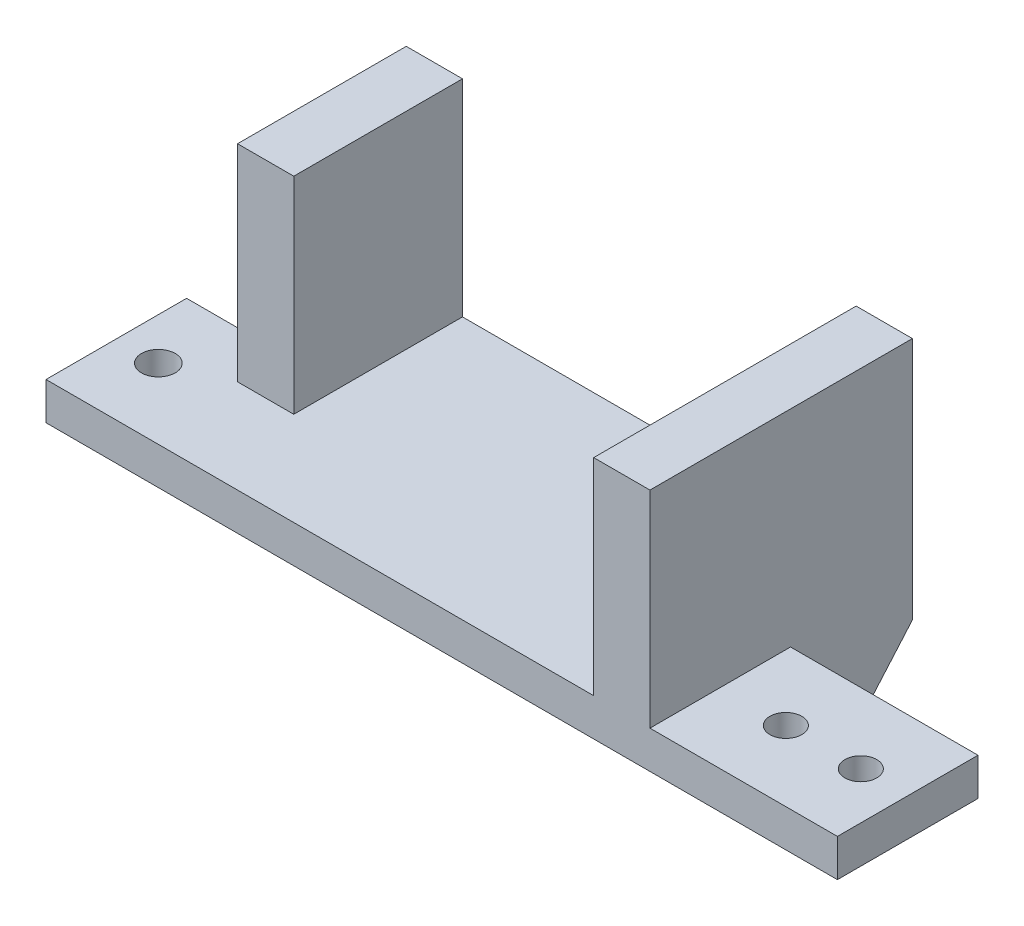
ISO-10303-21;
HEADER;
FILE_DESCRIPTION(('STEP AP214'),'2;1');
FILE_NAME('part.step','',(''),(''),'','','');
FILE_SCHEMA(('AUTOMOTIVE_DESIGN { 1 0 10303 214 1 1 1 1 }'));
ENDSEC;
DATA;
#1=APPLICATION_CONTEXT('core data for automotive mechanical design processes');
#2=APPLICATION_PROTOCOL_DEFINITION('international standard','automotive_design',2000,#1);
#3=PRODUCT_CONTEXT('',#1,'mechanical');
#4=PRODUCT('Part','Part','',(#3));
#5=PRODUCT_RELATED_PRODUCT_CATEGORY('part','',(#4));
#6=PRODUCT_DEFINITION_FORMATION('','',#4);
#7=PRODUCT_DEFINITION_CONTEXT('part definition',#1,'design');
#8=PRODUCT_DEFINITION('design','',#6,#7);
#9=PRODUCT_DEFINITION_SHAPE('','',#8);
#10=(LENGTH_UNIT() NAMED_UNIT(*) SI_UNIT(.MILLI.,.METRE.));
#11=(NAMED_UNIT(*) PLANE_ANGLE_UNIT() SI_UNIT($,.RADIAN.));
#12=(NAMED_UNIT(*) SI_UNIT($,.STERADIAN.) SOLID_ANGLE_UNIT());
#13=UNCERTAINTY_MEASURE_WITH_UNIT(LENGTH_MEASURE(1.E-05),#10,'distance_accuracy_value','');
#14=(GEOMETRIC_REPRESENTATION_CONTEXT(3) GLOBAL_UNCERTAINTY_ASSIGNED_CONTEXT((#13)) GLOBAL_UNIT_ASSIGNED_CONTEXT((#10,
#11,#12)) REPRESENTATION_CONTEXT('',''));
#15=CARTESIAN_POINT('',(0.,0.,0.));
#16=DIRECTION('',(0.,0.,1.));
#17=DIRECTION('',(1.,0.,0.));
#18=AXIS2_PLACEMENT_3D('',#15,#16,#17);
#19=CARTESIAN_POINT('',(0.,0.,0.));
#20=DIRECTION('',(0.,0.,1.));
#21=DIRECTION('',(1.,0.,0.));
#22=AXIS2_PLACEMENT_3D('',#19,#20,#21);
#23=PLANE('',#22);
#24=DIRECTION('',(-1.,0.,0.));
#25=VECTOR('',#24,1.);
#26=CARTESIAN_POINT('',(0.,0.,0.));
#27=LINE('',#26,#25);
#28=CARTESIAN_POINT('',(-27.,0.,0.));
#29=VERTEX_POINT('',#28);
#30=CARTESIAN_POINT('',(-37.4348056006468,0.,0.));
#31=VERTEX_POINT('',#30);
#32=EDGE_CURVE('E329',#29,#31,#27,.T.);
#33=ORIENTED_EDGE('',*,*,#32,.T.);
#34=DIRECTION('',(0.,1.,0.));
#35=VECTOR('',#34,1.);
#36=CARTESIAN_POINT('',(-37.4348056006468,-11.,0.));
#37=LINE('',#36,#35);
#38=CARTESIAN_POINT('',(-37.4348056006468,4.00000000000001,0.));
#39=VERTEX_POINT('',#38);
#40=EDGE_CURVE('E257',#31,#39,#37,.T.);
#41=ORIENTED_EDGE('',*,*,#40,.T.);
#42=DIRECTION('',(-1.,0.,0.));
#43=VECTOR('',#42,1.);
#44=CARTESIAN_POINT('',(0.,4.00000000000001,0.));
#45=LINE('',#44,#43);
#46=CARTESIAN_POINT('',(-27.,4.00000000000001,0.));
#47=VERTEX_POINT('',#46);
#48=EDGE_CURVE('E341',#47,#39,#45,.T.);
#49=ORIENTED_EDGE('',*,*,#48,.F.);
#50=DIRECTION('',(0.,1.,0.));
#51=VECTOR('',#50,1.);
#52=CARTESIAN_POINT('',(-27.,26.,0.));
#53=LINE('',#52,#51);
#54=EDGE_CURVE('E301',#29,#47,#53,.T.);
#55=ORIENTED_EDGE('',*,*,#54,.F.);
#56=EDGE_LOOP('',(#33,#41,#49,#55));
#57=FACE_BOUND('',#56,.T.);
#58=ADVANCED_FACE('F46',(#57),#23,.F.);
#59=DIRECTION('',(0.,-1.,0.));
#60=VECTOR('',#59,1.);
#61=CARTESIAN_POINT('',(27.,26.,0.));
#62=LINE('',#61,#60);
#63=CARTESIAN_POINT('',(27.,4.00000000000001,0.));
#64=VERTEX_POINT('',#63);
#65=CARTESIAN_POINT('',(27.,0.,0.));
#66=VERTEX_POINT('',#65);
#67=EDGE_CURVE('E330',#64,#66,#62,.T.);
#68=ORIENTED_EDGE('',*,*,#67,.F.);
#69=DIRECTION('',(1.,0.,0.));
#70=VECTOR('',#69,1.);
#71=CARTESIAN_POINT('',(0.,4.00000000000001,0.));
#72=LINE('',#71,#70);
#73=CARTESIAN_POINT('',(47.,4.00000000000001,0.));
#74=VERTEX_POINT('',#73);
#75=EDGE_CURVE('E365',#64,#74,#72,.T.);
#76=ORIENTED_EDGE('',*,*,#75,.T.);
#77=DIRECTION('',(0.,-1.,0.));
#78=VECTOR('',#77,1.);
#79=CARTESIAN_POINT('',(47.,0.,0.));
#80=LINE('',#79,#78);
#81=CARTESIAN_POINT('',(47.,0.,0.));
#82=VERTEX_POINT('',#81);
#83=EDGE_CURVE('E362',#74,#82,#80,.T.);
#84=ORIENTED_EDGE('',*,*,#83,.T.);
#85=EDGE_CURVE('E359',#82,#66,#27,.T.);
#86=ORIENTED_EDGE('',*,*,#85,.T.);
#87=EDGE_LOOP('',(#68,#76,#84,#86));
#88=FACE_BOUND('',#87,.T.);
#89=ADVANCED_FACE('F457',(#88),#23,.F.);
#90=CARTESIAN_POINT('',(0.,0.,15.));
#91=DIRECTION('',(0.,-1.,0.));
#92=DIRECTION('',(1.,0.,0.));
#93=AXIS2_PLACEMENT_3D('',#90,#91,#92);
#94=PLANE('',#93);
#95=DIRECTION('',(-1.,0.,0.));
#96=VECTOR('',#95,1.);
#97=CARTESIAN_POINT('',(27.,0.,0.));
#98=LINE('',#97,#96);
#99=EDGE_CURVE('E240',#66,#29,#98,.T.);
#100=ORIENTED_EDGE('',*,*,#99,.F.);
#101=ORIENTED_EDGE('',*,*,#85,.F.);
#102=DIRECTION('',(0.,0.,-1.));
#103=VECTOR('',#102,1.);
#104=CARTESIAN_POINT('',(47.,0.,15.));
#105=LINE('',#104,#103);
#106=CARTESIAN_POINT('',(47.,0.,15.));
#107=VERTEX_POINT('',#106);
#108=EDGE_CURVE('E334',#107,#82,#105,.T.);
#109=ORIENTED_EDGE('',*,*,#108,.F.);
#110=DIRECTION('',(-1.,0.,0.));
#111=VECTOR('',#110,1.);
#112=CARTESIAN_POINT('',(0.,0.,15.));
#113=LINE('',#112,#111);
#114=CARTESIAN_POINT('',(-37.4348056006468,0.,15.));
#115=VERTEX_POINT('',#114);
#116=EDGE_CURVE('E337',#107,#115,#113,.T.);
#117=ORIENTED_EDGE('',*,*,#116,.T.);
#118=DIRECTION('',(0.,0.,1.));
#119=VECTOR('',#118,1.);
#120=CARTESIAN_POINT('',(-37.4348056006468,0.,15.));
#121=LINE('',#120,#119);
#122=EDGE_CURVE('E261',#31,#115,#121,.T.);
#123=ORIENTED_EDGE('',*,*,#122,.F.);
#124=ORIENTED_EDGE('',*,*,#32,.F.);
#125=EDGE_LOOP('',(#100,#101,#109,#117,#123,#124));
#126=FACE_BOUND('',#125,.T.);
#127=CARTESIAN_POINT('',(34.,0.,7.5));
#128=DIRECTION('',(0.,-1.,0.));
#129=DIRECTION('',(1.,0.,0.));
#130=AXIS2_PLACEMENT_3D('',#127,#128,#129);
#131=CIRCLE('',#130,1.7);
#132=CARTESIAN_POINT('',(35.7,0.,7.5));
#133=VERTEX_POINT('',#132);
#134=EDGE_CURVE('E276',#133,#133,#131,.T.);
#135=ORIENTED_EDGE('',*,*,#134,.F.);
#136=EDGE_LOOP('',(#135));
#137=FACE_BOUND('',#136,.T.);
#138=CARTESIAN_POINT('',(42.,0.,7.5));
#139=DIRECTION('',(0.,-1.,0.));
#140=DIRECTION('',(1.,0.,0.));
#141=AXIS2_PLACEMENT_3D('',#138,#139,#140);
#142=CIRCLE('',#141,1.7);
#143=CARTESIAN_POINT('',(43.7,0.,7.5));
#144=VERTEX_POINT('',#143);
#145=EDGE_CURVE('E273',#144,#144,#142,.T.);
#146=ORIENTED_EDGE('',*,*,#145,.F.);
#147=EDGE_LOOP('',(#146));
#148=FACE_BOUND('',#147,.T.);
#149=CARTESIAN_POINT('',(-32.9497943466124,0.,7.5));
#150=DIRECTION('',(0.,-1.,0.));
#151=DIRECTION('',(1.,0.,0.));
#152=AXIS2_PLACEMENT_3D('',#149,#150,#151);
#153=CIRCLE('',#152,1.8);
#154=CARTESIAN_POINT('',(-31.1497943466124,0.,7.5));
#155=VERTEX_POINT('',#154);
#156=EDGE_CURVE('E270',#155,#155,#153,.T.);
#157=ORIENTED_EDGE('',*,*,#156,.F.);
#158=EDGE_LOOP('',(#157));
#159=FACE_BOUND('',#158,.T.);
#160=ADVANCED_FACE('F48',(#126,#137,#148,#159),#94,.T.);
#161=CARTESIAN_POINT('',(47.,0.,15.));
#162=DIRECTION('',(1.,0.,0.));
#163=DIRECTION('',(0.,0.,-1.));
#164=AXIS2_PLACEMENT_3D('',#161,#162,#163);
#165=PLANE('',#164);
#166=ORIENTED_EDGE('',*,*,#83,.F.);
#167=DIRECTION('',(0.,0.,-1.));
#168=VECTOR('',#167,1.);
#169=CARTESIAN_POINT('',(47.,4.00000000000001,15.));
#170=LINE('',#169,#168);
#171=CARTESIAN_POINT('',(47.,4.00000000000001,15.));
#172=VERTEX_POINT('',#171);
#173=EDGE_CURVE('E386',#172,#74,#170,.T.);
#174=ORIENTED_EDGE('',*,*,#173,.F.);
#175=DIRECTION('',(0.,-1.,0.));
#176=VECTOR('',#175,1.);
#177=CARTESIAN_POINT('',(47.,0.,15.));
#178=LINE('',#177,#176);
#179=EDGE_CURVE('E340',#172,#107,#178,.T.);
#180=ORIENTED_EDGE('',*,*,#179,.T.);
#181=ORIENTED_EDGE('',*,*,#108,.T.);
#182=EDGE_LOOP('',(#166,#174,#180,#181));
#183=FACE_BOUND('',#182,.T.);
#184=ADVANCED_FACE('F504',(#183),#165,.T.);
#185=CARTESIAN_POINT('',(0.,4.00000000000001,15.));
#186=DIRECTION('',(0.,1.,0.));
#187=DIRECTION('',(0.,0.,1.));
#188=AXIS2_PLACEMENT_3D('',#185,#186,#187);
#189=PLANE('',#188);
#190=CARTESIAN_POINT('',(34.,4.00000000000001,7.5));
#191=DIRECTION('',(0.,1.,0.));
#192=DIRECTION('',(-1.,0.,0.));
#193=AXIS2_PLACEMENT_3D('',#190,#191,#192);
#194=CIRCLE('',#193,1.7);
#195=CARTESIAN_POINT('',(32.3,4.00000000000001,7.5));
#196=VERTEX_POINT('',#195);
#197=EDGE_CURVE('E253',#196,#196,#194,.T.);
#198=ORIENTED_EDGE('',*,*,#197,.F.);
#199=EDGE_LOOP('',(#198));
#200=FACE_BOUND('',#199,.T.);
#201=CARTESIAN_POINT('',(42.,4.00000000000001,7.5));
#202=DIRECTION('',(0.,1.,0.));
#203=DIRECTION('',(-1.,0.,0.));
#204=AXIS2_PLACEMENT_3D('',#201,#202,#203);
#205=CIRCLE('',#204,1.7);
#206=CARTESIAN_POINT('',(40.3,4.00000000000001,7.5));
#207=VERTEX_POINT('',#206);
#208=EDGE_CURVE('E264',#207,#207,#205,.T.);
#209=ORIENTED_EDGE('',*,*,#208,.F.);
#210=EDGE_LOOP('',(#209));
#211=FACE_BOUND('',#210,.T.);
#212=ORIENTED_EDGE('',*,*,#75,.F.);
#213=DIRECTION('',(0.,0.,-1.));
#214=VECTOR('',#213,1.);
#215=CARTESIAN_POINT('',(27.,4.00000000000001,15.));
#216=LINE('',#215,#214);
#217=CARTESIAN_POINT('',(27.,4.00000000000001,15.));
#218=VERTEX_POINT('',#217);
#219=EDGE_CURVE('E383',#218,#64,#216,.T.);
#220=ORIENTED_EDGE('',*,*,#219,.F.);
#221=DIRECTION('',(1.,0.,0.));
#222=VECTOR('',#221,1.);
#223=CARTESIAN_POINT('',(0.,4.00000000000001,15.));
#224=LINE('',#223,#222);
#225=EDGE_CURVE('E344',#218,#172,#224,.T.);
#226=ORIENTED_EDGE('',*,*,#225,.T.);
#227=ORIENTED_EDGE('',*,*,#173,.T.);
#228=EDGE_LOOP('',(#212,#220,#226,#227));
#229=FACE_BOUND('',#228,.T.);
#230=ADVANCED_FACE('F454',(#200,#211,#229),#189,.T.);
#231=CARTESIAN_POINT('',(27.,0.,15.));
#232=DIRECTION('',(1.,0.,0.));
#233=DIRECTION('',(0.,1.,0.));
#234=AXIS2_PLACEMENT_3D('',#231,#232,#233);
#235=PLANE('',#234);
#236=ORIENTED_EDGE('',*,*,#219,.T.);
#237=ORIENTED_EDGE('',*,*,#67,.T.);
#238=DIRECTION('',(0.,1.,0.));
#239=VECTOR('',#238,1.);
#240=CARTESIAN_POINT('',(27.,0.,0.));
#241=LINE('',#240,#239);
#242=CARTESIAN_POINT('',(27.,-15.,0.));
#243=VERTEX_POINT('',#242);
#244=EDGE_CURVE('E231',#243,#66,#241,.T.);
#245=ORIENTED_EDGE('',*,*,#244,.F.);
#246=DIRECTION('',(0.,-0.755689082789818,0.654930538417842));
#247=VECTOR('',#246,1.);
#248=CARTESIAN_POINT('',(27.,-15.,0.));
#249=LINE('',#248,#247);
#250=CARTESIAN_POINT('',(27.,0.,-13.));
#251=VERTEX_POINT('',#250);
#252=EDGE_CURVE('E228',#251,#243,#249,.T.);
#253=ORIENTED_EDGE('',*,*,#252,.F.);
#254=DIRECTION('',(0.,-1.,0.));
#255=VECTOR('',#254,1.);
#256=CARTESIAN_POINT('',(27.,26.,-13.));
#257=LINE('',#256,#255);
#258=CARTESIAN_POINT('',(27.,26.,-13.));
#259=VERTEX_POINT('',#258);
#260=EDGE_CURVE('E307',#259,#251,#257,.T.);
#261=ORIENTED_EDGE('',*,*,#260,.F.);
#262=DIRECTION('',(0.,0.,-1.));
#263=VECTOR('',#262,1.);
#264=CARTESIAN_POINT('',(27.,26.,15.));
#265=LINE('',#264,#263);
#266=CARTESIAN_POINT('',(27.,26.,15.));
#267=VERTEX_POINT('',#266);
#268=EDGE_CURVE('E381',#267,#259,#265,.T.);
#269=ORIENTED_EDGE('',*,*,#268,.F.);
#270=DIRECTION('',(0.,-1.,0.));
#271=VECTOR('',#270,1.);
#272=CARTESIAN_POINT('',(27.,0.,15.));
#273=LINE('',#272,#271);
#274=EDGE_CURVE('E347',#267,#218,#273,.T.);
#275=ORIENTED_EDGE('',*,*,#274,.T.);
#276=EDGE_LOOP('',(#236,#237,#245,#253,#261,#269,#275));
#277=FACE_BOUND('',#276,.T.);
#278=ADVANCED_FACE('F411',(#277),#235,.T.);
#279=CARTESIAN_POINT('',(0.,26.,15.));
#280=DIRECTION('',(0.,1.,0.));
#281=DIRECTION('',(-1.,0.,0.));
#282=AXIS2_PLACEMENT_3D('',#279,#280,#281);
#283=PLANE('',#282);
#284=ORIENTED_EDGE('',*,*,#268,.T.);
#285=DIRECTION('',(1.,0.,0.));
#286=VECTOR('',#285,1.);
#287=CARTESIAN_POINT('',(27.,26.,-13.));
#288=LINE('',#287,#286);
#289=CARTESIAN_POINT('',(21.,26.,-13.));
#290=VERTEX_POINT('',#289);
#291=EDGE_CURVE('E304',#290,#259,#288,.T.);
#292=ORIENTED_EDGE('',*,*,#291,.F.);
#293=DIRECTION('',(0.,0.,-1.));
#294=VECTOR('',#293,1.);
#295=CARTESIAN_POINT('',(21.,26.,15.));
#296=LINE('',#295,#294);
#297=CARTESIAN_POINT('',(21.,26.,15.));
#298=VERTEX_POINT('',#297);
#299=EDGE_CURVE('E379',#298,#290,#296,.T.);
#300=ORIENTED_EDGE('',*,*,#299,.F.);
#301=DIRECTION('',(1.,0.,0.));
#302=VECTOR('',#301,1.);
#303=CARTESIAN_POINT('',(0.,26.,15.));
#304=LINE('',#303,#302);
#305=EDGE_CURVE('E350',#298,#267,#304,.T.);
#306=ORIENTED_EDGE('',*,*,#305,.T.);
#307=EDGE_LOOP('',(#284,#292,#300,#306));
#308=FACE_BOUND('',#307,.T.);
#309=ADVANCED_FACE('F444',(#308),#283,.T.);
#310=CARTESIAN_POINT('',(21.,0.,15.));
#311=DIRECTION('',(-1.,0.,0.));
#312=DIRECTION('',(0.,0.,1.));
#313=AXIS2_PLACEMENT_3D('',#310,#311,#312);
#314=PLANE('',#313);
#315=ORIENTED_EDGE('',*,*,#299,.T.);
#316=DIRECTION('',(0.,1.,0.));
#317=VECTOR('',#316,1.);
#318=CARTESIAN_POINT('',(21.,26.,-13.));
#319=LINE('',#318,#317);
#320=CARTESIAN_POINT('',(21.,4.00000000000001,-13.));
#321=VERTEX_POINT('',#320);
#322=EDGE_CURVE('E326',#321,#290,#319,.T.);
#323=ORIENTED_EDGE('',*,*,#322,.F.);
#324=DIRECTION('',(0.,0.,-1.));
#325=VECTOR('',#324,1.);
#326=CARTESIAN_POINT('',(21.,4.00000000000001,15.));
#327=LINE('',#326,#325);
#328=CARTESIAN_POINT('',(21.,4.00000000000001,15.));
#329=VERTEX_POINT('',#328);
#330=EDGE_CURVE('E377',#329,#321,#327,.T.);
#331=ORIENTED_EDGE('',*,*,#330,.F.);
#332=DIRECTION('',(0.,1.,0.));
#333=VECTOR('',#332,1.);
#334=CARTESIAN_POINT('',(21.,0.,15.));
#335=LINE('',#334,#333);
#336=EDGE_CURVE('E353',#329,#298,#335,.T.);
#337=ORIENTED_EDGE('',*,*,#336,.T.);
#338=EDGE_LOOP('',(#315,#323,#331,#337));
#339=FACE_BOUND('',#338,.T.);
#340=ADVANCED_FACE('F441',(#339),#314,.T.);
#341=CARTESIAN_POINT('',(-21.,0.,15.));
#342=DIRECTION('',(-1.,0.,0.));
#343=DIRECTION('',(0.,-1.,0.));
#344=AXIS2_PLACEMENT_3D('',#341,#342,#343);
#345=PLANE('',#344);
#346=DIRECTION('',(0.,0.,-1.));
#347=VECTOR('',#346,1.);
#348=CARTESIAN_POINT('',(-21.,26.,15.));
#349=LINE('',#348,#347);
#350=CARTESIAN_POINT('',(-21.,26.,5.));
#351=VERTEX_POINT('',#350);
#352=CARTESIAN_POINT('',(-21.,26.,-13.));
#353=VERTEX_POINT('',#352);
#354=EDGE_CURVE('E373',#351,#353,#349,.T.);
#355=ORIENTED_EDGE('',*,*,#354,.F.);
#356=DIRECTION('',(0.,1.,0.));
#357=VECTOR('',#356,1.);
#358=CARTESIAN_POINT('',(-21.,4.,5.));
#359=LINE('',#358,#357);
#360=CARTESIAN_POINT('',(-21.,4.,5.));
#361=VERTEX_POINT('',#360);
#362=EDGE_CURVE('E248',#361,#351,#359,.T.);
#363=ORIENTED_EDGE('',*,*,#362,.F.);
#364=DIRECTION('',(0.,0.,-1.));
#365=VECTOR('',#364,1.);
#366=CARTESIAN_POINT('',(-21.,4.00000000000001,15.));
#367=LINE('',#366,#365);
#368=CARTESIAN_POINT('',(-21.,4.00000000000001,-13.));
#369=VERTEX_POINT('',#368);
#370=EDGE_CURVE('E375',#361,#369,#367,.T.);
#371=ORIENTED_EDGE('',*,*,#370,.T.);
#372=DIRECTION('',(0.,-1.,0.));
#373=VECTOR('',#372,1.);
#374=CARTESIAN_POINT('',(-21.,4.00000000000001,-13.));
#375=LINE('',#374,#373);
#376=EDGE_CURVE('E320',#353,#369,#375,.T.);
#377=ORIENTED_EDGE('',*,*,#376,.F.);
#378=EDGE_LOOP('',(#355,#363,#371,#377));
#379=FACE_BOUND('',#378,.T.);
#380=ADVANCED_FACE('F431',(#379),#345,.F.);
#381=CARTESIAN_POINT('',(0.,26.,15.));
#382=DIRECTION('',(0.,-1.,0.));
#383=DIRECTION('',(0.,0.,-1.));
#384=AXIS2_PLACEMENT_3D('',#381,#382,#383);
#385=PLANE('',#384);
#386=DIRECTION('',(0.,0.,-1.));
#387=VECTOR('',#386,1.);
#388=CARTESIAN_POINT('',(-27.,26.,15.));
#389=LINE('',#388,#387);
#390=CARTESIAN_POINT('',(-27.,26.,5.));
#391=VERTEX_POINT('',#390);
#392=CARTESIAN_POINT('',(-27.,26.,-13.));
#393=VERTEX_POINT('',#392);
#394=EDGE_CURVE('E371',#391,#393,#389,.T.);
#395=ORIENTED_EDGE('',*,*,#394,.F.);
#396=DIRECTION('',(-1.,0.,0.));
#397=VECTOR('',#396,1.);
#398=CARTESIAN_POINT('',(-27.,26.,5.));
#399=LINE('',#398,#397);
#400=EDGE_CURVE('E243',#351,#391,#399,.T.);
#401=ORIENTED_EDGE('',*,*,#400,.F.);
#402=ORIENTED_EDGE('',*,*,#354,.T.);
#403=DIRECTION('',(1.,0.,0.));
#404=VECTOR('',#403,1.);
#405=CARTESIAN_POINT('',(-21.,26.,-13.));
#406=LINE('',#405,#404);
#407=EDGE_CURVE('E317',#393,#353,#406,.T.);
#408=ORIENTED_EDGE('',*,*,#407,.F.);
#409=EDGE_LOOP('',(#395,#401,#402,#408));
#410=FACE_BOUND('',#409,.T.);
#411=ADVANCED_FACE('F426',(#410),#385,.F.);
#412=CARTESIAN_POINT('',(-27.,0.,15.));
#413=DIRECTION('',(1.,0.,0.));
#414=DIRECTION('',(0.,1.,0.));
#415=AXIS2_PLACEMENT_3D('',#412,#413,#414);
#416=PLANE('',#415);
#417=DIRECTION('',(0.,0.,-1.));
#418=VECTOR('',#417,1.);
#419=CARTESIAN_POINT('',(-27.,4.00000000000001,15.));
#420=LINE('',#419,#418);
#421=CARTESIAN_POINT('',(-27.,4.,5.));
#422=VERTEX_POINT('',#421);
#423=EDGE_CURVE('E358',#422,#47,#420,.T.);
#424=ORIENTED_EDGE('',*,*,#423,.F.);
#425=DIRECTION('',(0.,1.,0.));
#426=VECTOR('',#425,1.);
#427=CARTESIAN_POINT('',(-27.,4.,5.));
#428=LINE('',#427,#426);
#429=EDGE_CURVE('E250',#422,#391,#428,.T.);
#430=ORIENTED_EDGE('',*,*,#429,.T.);
#431=ORIENTED_EDGE('',*,*,#394,.T.);
#432=DIRECTION('',(0.,1.,0.));
#433=VECTOR('',#432,1.);
#434=CARTESIAN_POINT('',(-27.,4.00000000000001,-13.));
#435=LINE('',#434,#433);
#436=CARTESIAN_POINT('',(-27.,0.,-13.));
#437=VERTEX_POINT('',#436);
#438=EDGE_CURVE('E313',#437,#393,#435,.T.);
#439=ORIENTED_EDGE('',*,*,#438,.F.);
#440=DIRECTION('',(0.,-0.755689082789818,0.654930538417842));
#441=VECTOR('',#440,1.);
#442=CARTESIAN_POINT('',(-27.,-15.,0.));
#443=LINE('',#442,#441);
#444=CARTESIAN_POINT('',(-27.,-15.,0.));
#445=VERTEX_POINT('',#444);
#446=EDGE_CURVE('E210',#437,#445,#443,.T.);
#447=ORIENTED_EDGE('',*,*,#446,.T.);
#448=DIRECTION('',(0.,1.,0.));
#449=VECTOR('',#448,1.);
#450=CARTESIAN_POINT('',(-27.,0.,0.));
#451=LINE('',#450,#449);
#452=EDGE_CURVE('E232',#445,#29,#451,.T.);
#453=ORIENTED_EDGE('',*,*,#452,.T.);
#454=ORIENTED_EDGE('',*,*,#54,.T.);
#455=EDGE_LOOP('',(#424,#430,#431,#439,#447,#453,#454));
#456=FACE_BOUND('',#455,.T.);
#457=ADVANCED_FACE('F421',(#456),#416,.F.);
#458=CARTESIAN_POINT('',(0.,4.00000000000001,15.));
#459=DIRECTION('',(0.,-1.,0.));
#460=DIRECTION('',(0.,0.,-1.));
#461=AXIS2_PLACEMENT_3D('',#458,#459,#460);
#462=PLANE('',#461);
#463=CARTESIAN_POINT('',(-32.9497943466124,4.00000000000001,7.5));
#464=DIRECTION('',(0.,1.,0.));
#465=DIRECTION('',(-1.,0.,0.));
#466=AXIS2_PLACEMENT_3D('',#463,#464,#465);
#467=CIRCLE('',#466,1.8);
#468=CARTESIAN_POINT('',(-34.7497943466124,4.00000000000001,7.5));
#469=VERTEX_POINT('',#468);
#470=EDGE_CURVE('E258',#469,#469,#467,.T.);
#471=ORIENTED_EDGE('',*,*,#470,.F.);
#472=EDGE_LOOP('',(#471));
#473=FACE_BOUND('',#472,.T.);
#474=ORIENTED_EDGE('',*,*,#48,.T.);
#475=DIRECTION('',(0.,0.,-1.));
#476=VECTOR('',#475,1.);
#477=CARTESIAN_POINT('',(-37.4348056006468,4.00000000000001,0.));
#478=LINE('',#477,#476);
#479=CARTESIAN_POINT('',(-37.4348056006468,4.00000000000001,15.));
#480=VERTEX_POINT('',#479);
#481=EDGE_CURVE('E255',#480,#39,#478,.T.);
#482=ORIENTED_EDGE('',*,*,#481,.F.);
#483=DIRECTION('',(-1.,0.,0.));
#484=VECTOR('',#483,1.);
#485=CARTESIAN_POINT('',(0.,4.00000000000001,15.));
#486=LINE('',#485,#484);
#487=EDGE_CURVE('E356',#329,#480,#486,.T.);
#488=ORIENTED_EDGE('',*,*,#487,.F.);
#489=ORIENTED_EDGE('',*,*,#330,.T.);
#490=DIRECTION('',(1.,0.,0.));
#491=VECTOR('',#490,1.);
#492=CARTESIAN_POINT('',(21.,4.00000000000001,-13.));
#493=LINE('',#492,#491);
#494=EDGE_CURVE('E323',#369,#321,#493,.T.);
#495=ORIENTED_EDGE('',*,*,#494,.F.);
#496=ORIENTED_EDGE('',*,*,#370,.F.);
#497=DIRECTION('',(-1.,0.,0.));
#498=VECTOR('',#497,1.);
#499=CARTESIAN_POINT('',(-27.,4.,5.));
#500=LINE('',#499,#498);
#501=EDGE_CURVE('E245',#361,#422,#500,.T.);
#502=ORIENTED_EDGE('',*,*,#501,.T.);
#503=ORIENTED_EDGE('',*,*,#423,.T.);
#504=EDGE_LOOP('',(#474,#482,#488,#489,#495,#496,#502,#503));
#505=FACE_BOUND('',#504,.T.);
#506=ADVANCED_FACE('F436',(#473,#505),#462,.F.);
#507=CARTESIAN_POINT('',(0.,0.,15.));
#508=DIRECTION('',(0.,0.,1.));
#509=DIRECTION('',(1.,0.,0.));
#510=AXIS2_PLACEMENT_3D('',#507,#508,#509);
#511=PLANE('',#510);
#512=ORIENTED_EDGE('',*,*,#487,.T.);
#513=DIRECTION('',(0.,1.,0.));
#514=VECTOR('',#513,1.);
#515=CARTESIAN_POINT('',(-37.4348056006468,0.,15.));
#516=LINE('',#515,#514);
#517=EDGE_CURVE('E333',#115,#480,#516,.T.);
#518=ORIENTED_EDGE('',*,*,#517,.F.);
#519=ORIENTED_EDGE('',*,*,#116,.F.);
#520=ORIENTED_EDGE('',*,*,#179,.F.);
#521=ORIENTED_EDGE('',*,*,#225,.F.);
#522=ORIENTED_EDGE('',*,*,#274,.F.);
#523=ORIENTED_EDGE('',*,*,#305,.F.);
#524=ORIENTED_EDGE('',*,*,#336,.F.);
#525=EDGE_LOOP('',(#512,#518,#519,#520,#521,#522,#523,#524));
#526=FACE_BOUND('',#525,.T.);
#527=ADVANCED_FACE('F449',(#526),#511,.T.);
#528=CARTESIAN_POINT('',(0.,0.,-13.));
#529=DIRECTION('',(0.,0.,1.));
#530=DIRECTION('',(1.,0.,0.));
#531=AXIS2_PLACEMENT_3D('',#528,#529,#530);
#532=PLANE('',#531);
#533=CARTESIAN_POINT('',(-24.,20.95,-13.));
#534=DIRECTION('',(0.,0.,-1.));
#535=DIRECTION('',(-1.,0.,0.));
#536=AXIS2_PLACEMENT_3D('',#533,#534,#535);
#537=CIRCLE('',#536,1.8);
#538=CARTESIAN_POINT('',(-25.8,20.95,-13.));
#539=VERTEX_POINT('',#538);
#540=EDGE_CURVE('E286',#539,#539,#537,.T.);
#541=ORIENTED_EDGE('',*,*,#540,.F.);
#542=EDGE_LOOP('',(#541));
#543=FACE_BOUND('',#542,.T.);
#544=CARTESIAN_POINT('',(24.,11.05,-13.));
#545=DIRECTION('',(0.,0.,-1.));
#546=DIRECTION('',(-1.,0.,0.));
#547=AXIS2_PLACEMENT_3D('',#544,#545,#546);
#548=CIRCLE('',#547,1.8);
#549=CARTESIAN_POINT('',(22.2,11.05,-13.));
#550=VERTEX_POINT('',#549);
#551=EDGE_CURVE('E293',#550,#550,#548,.T.);
#552=ORIENTED_EDGE('',*,*,#551,.F.);
#553=EDGE_LOOP('',(#552));
#554=FACE_BOUND('',#553,.T.);
#555=CARTESIAN_POINT('',(24.,20.95,-13.));
#556=DIRECTION('',(0.,0.,-1.));
#557=DIRECTION('',(-1.,0.,0.));
#558=AXIS2_PLACEMENT_3D('',#555,#556,#557);
#559=CIRCLE('',#558,1.8);
#560=CARTESIAN_POINT('',(22.2,20.95,-13.));
#561=VERTEX_POINT('',#560);
#562=EDGE_CURVE('E280',#561,#561,#559,.T.);
#563=ORIENTED_EDGE('',*,*,#562,.F.);
#564=EDGE_LOOP('',(#563));
#565=FACE_BOUND('',#564,.T.);
#566=CARTESIAN_POINT('',(-24.,11.05,-13.));
#567=DIRECTION('',(0.,0.,-1.));
#568=DIRECTION('',(-1.,0.,0.));
#569=AXIS2_PLACEMENT_3D('',#566,#567,#568);
#570=CIRCLE('',#569,1.8);
#571=CARTESIAN_POINT('',(-25.8,11.05,-13.));
#572=VERTEX_POINT('',#571);
#573=EDGE_CURVE('E289',#572,#572,#570,.T.);
#574=ORIENTED_EDGE('',*,*,#573,.F.);
#575=EDGE_LOOP('',(#574));
#576=FACE_BOUND('',#575,.T.);
#577=ORIENTED_EDGE('',*,*,#291,.T.);
#578=ORIENTED_EDGE('',*,*,#260,.T.);
#579=DIRECTION('',(-1.,0.,0.));
#580=VECTOR('',#579,1.);
#581=CARTESIAN_POINT('',(-27.,0.,-13.));
#582=LINE('',#581,#580);
#583=CARTESIAN_POINT('',(21.,0.,-13.));
#584=VERTEX_POINT('',#583);
#585=EDGE_CURVE('E310',#251,#584,#582,.T.);
#586=ORIENTED_EDGE('',*,*,#585,.T.);
#587=DIRECTION('',(-1.,0.,0.));
#588=VECTOR('',#587,1.);
#589=CARTESIAN_POINT('',(0.,0.,-13.));
#590=LINE('',#589,#588);
#591=CARTESIAN_POINT('',(3.,0.,-13.));
#592=VERTEX_POINT('',#591);
#593=EDGE_CURVE('E201',#584,#592,#590,.T.);
#594=ORIENTED_EDGE('',*,*,#593,.T.);
#595=CARTESIAN_POINT('',(-3.,0.,-13.));
#596=VERTEX_POINT('',#595);
#597=EDGE_CURVE('E314',#592,#596,#582,.T.);
#598=ORIENTED_EDGE('',*,*,#597,.T.);
#599=DIRECTION('',(-1.,0.,0.));
#600=VECTOR('',#599,1.);
#601=CARTESIAN_POINT('',(0.,0.,-13.));
#602=LINE('',#601,#600);
#603=CARTESIAN_POINT('',(-21.,0.,-13.));
#604=VERTEX_POINT('',#603);
#605=EDGE_CURVE('E218',#596,#604,#602,.T.);
#606=ORIENTED_EDGE('',*,*,#605,.T.);
#607=EDGE_CURVE('E309',#604,#437,#582,.T.);
#608=ORIENTED_EDGE('',*,*,#607,.T.);
#609=ORIENTED_EDGE('',*,*,#438,.T.);
#610=ORIENTED_EDGE('',*,*,#407,.T.);
#611=ORIENTED_EDGE('',*,*,#376,.T.);
#612=ORIENTED_EDGE('',*,*,#494,.T.);
#613=ORIENTED_EDGE('',*,*,#322,.T.);
#614=EDGE_LOOP('',(#577,#578,#586,#594,#598,#606,#608,#609,#610,#611,#612,#613));
#615=FACE_BOUND('',#614,.T.);
#616=ADVANCED_FACE('F406',(#543,#554,#565,#576,#615),#532,.F.);
#617=CARTESIAN_POINT('',(-24.,11.05,-3.));
#618=DIRECTION('',(0.,0.,-1.));
#619=DIRECTION('',(-1.,0.,0.));
#620=AXIS2_PLACEMENT_3D('',#617,#618,#619);
#621=CYLINDRICAL_SURFACE('',#620,1.8);
#622=CARTESIAN_POINT('',(-24.,11.05,-3.));
#623=DIRECTION('',(0.,0.,-1.));
#624=DIRECTION('',(-1.,0.,0.));
#625=AXIS2_PLACEMENT_3D('',#622,#623,#624);
#626=CIRCLE('',#625,1.8);
#627=CARTESIAN_POINT('',(-25.8,11.05,-3.));
#628=VERTEX_POINT('',#627);
#629=EDGE_CURVE('E298',#628,#628,#626,.T.);
#630=ORIENTED_EDGE('',*,*,#629,.F.);
#631=EDGE_LOOP('',(#630));
#632=FACE_BOUND('',#631,.T.);
#633=ORIENTED_EDGE('',*,*,#573,.T.);
#634=EDGE_LOOP('',(#633));
#635=FACE_BOUND('',#634,.T.);
#636=ADVANCED_FACE('F677',(#632,#635),#621,.F.);
#637=CARTESIAN_POINT('',(-24.,11.05,-3.));
#638=DIRECTION('',(0.,0.,-1.));
#639=DIRECTION('',(-1.,0.,0.));
#640=AXIS2_PLACEMENT_3D('',#637,#638,#639);
#641=PLANE('',#640);
#642=ORIENTED_EDGE('',*,*,#629,.T.);
#643=EDGE_LOOP('',(#642));
#644=FACE_BOUND('',#643,.T.);
#645=ADVANCED_FACE('F666',(#644),#641,.T.);
#646=CARTESIAN_POINT('',(24.,20.95,-3.));
#647=DIRECTION('',(0.,0.,-1.));
#648=DIRECTION('',(-1.,0.,0.));
#649=AXIS2_PLACEMENT_3D('',#646,#647,#648);
#650=CYLINDRICAL_SURFACE('',#649,1.8);
#651=ORIENTED_EDGE('',*,*,#562,.T.);
#652=EDGE_LOOP('',(#651));
#653=FACE_BOUND('',#652,.T.);
#654=CARTESIAN_POINT('',(24.,20.95,-3.));
#655=DIRECTION('',(0.,0.,-1.));
#656=DIRECTION('',(-1.,0.,0.));
#657=AXIS2_PLACEMENT_3D('',#654,#655,#656);
#658=CIRCLE('',#657,1.8);
#659=CARTESIAN_POINT('',(22.2,20.95,-3.));
#660=VERTEX_POINT('',#659);
#661=EDGE_CURVE('E279',#660,#660,#658,.T.);
#662=ORIENTED_EDGE('',*,*,#661,.F.);
#663=EDGE_LOOP('',(#662));
#664=FACE_BOUND('',#663,.T.);
#665=ADVANCED_FACE('F656',(#653,#664),#650,.F.);
#666=CARTESIAN_POINT('',(0.,0.,-3.));
#667=DIRECTION('',(0.,0.,-1.));
#668=DIRECTION('',(-1.,0.,0.));
#669=AXIS2_PLACEMENT_3D('',#666,#667,#668);
#670=PLANE('',#669);
#671=ORIENTED_EDGE('',*,*,#661,.T.);
#672=EDGE_LOOP('',(#671));
#673=FACE_BOUND('',#672,.T.);
#674=ADVANCED_FACE('F646',(#673),#670,.T.);
#675=CARTESIAN_POINT('',(24.,11.05,-3.));
#676=DIRECTION('',(0.,0.,-1.));
#677=DIRECTION('',(-1.,0.,0.));
#678=AXIS2_PLACEMENT_3D('',#675,#676,#677);
#679=CYLINDRICAL_SURFACE('',#678,1.8);
#680=CARTESIAN_POINT('',(24.,11.05,-3.));
#681=DIRECTION('',(0.,0.,-1.));
#682=DIRECTION('',(-1.,0.,0.));
#683=AXIS2_PLACEMENT_3D('',#680,#681,#682);
#684=CIRCLE('',#683,1.8);
#685=CARTESIAN_POINT('',(22.2,11.05,-3.));
#686=VERTEX_POINT('',#685);
#687=EDGE_CURVE('E283',#686,#686,#684,.T.);
#688=ORIENTED_EDGE('',*,*,#687,.F.);
#689=EDGE_LOOP('',(#688));
#690=FACE_BOUND('',#689,.T.);
#691=ORIENTED_EDGE('',*,*,#551,.T.);
#692=EDGE_LOOP('',(#691));
#693=FACE_BOUND('',#692,.T.);
#694=ADVANCED_FACE('F636',(#690,#693),#679,.F.);
#695=CARTESIAN_POINT('',(24.,11.05,-3.));
#696=DIRECTION('',(0.,0.,-1.));
#697=DIRECTION('',(-1.,0.,0.));
#698=AXIS2_PLACEMENT_3D('',#695,#696,#697);
#699=PLANE('',#698);
#700=ORIENTED_EDGE('',*,*,#687,.T.);
#701=EDGE_LOOP('',(#700));
#702=FACE_BOUND('',#701,.T.);
#703=ADVANCED_FACE('F626',(#702),#699,.T.);
#704=CARTESIAN_POINT('',(-24.,20.95,-3.));
#705=DIRECTION('',(0.,0.,-1.));
#706=DIRECTION('',(-1.,0.,0.));
#707=AXIS2_PLACEMENT_3D('',#704,#705,#706);
#708=CYLINDRICAL_SURFACE('',#707,1.8);
#709=CARTESIAN_POINT('',(-24.,20.95,-3.));
#710=DIRECTION('',(0.,0.,-1.));
#711=DIRECTION('',(-1.,0.,0.));
#712=AXIS2_PLACEMENT_3D('',#709,#710,#711);
#713=CIRCLE('',#712,1.8);
#714=CARTESIAN_POINT('',(-25.8,20.95,-3.));
#715=VERTEX_POINT('',#714);
#716=EDGE_CURVE('E290',#715,#715,#713,.T.);
#717=ORIENTED_EDGE('',*,*,#716,.F.);
#718=EDGE_LOOP('',(#717));
#719=FACE_BOUND('',#718,.T.);
#720=ORIENTED_EDGE('',*,*,#540,.T.);
#721=EDGE_LOOP('',(#720));
#722=FACE_BOUND('',#721,.T.);
#723=ADVANCED_FACE('F616',(#719,#722),#708,.F.);
#724=CARTESIAN_POINT('',(-24.,20.95,-3.));
#725=DIRECTION('',(0.,0.,-1.));
#726=DIRECTION('',(-1.,0.,0.));
#727=AXIS2_PLACEMENT_3D('',#724,#725,#726);
#728=PLANE('',#727);
#729=ORIENTED_EDGE('',*,*,#716,.T.);
#730=EDGE_LOOP('',(#729));
#731=FACE_BOUND('',#730,.T.);
#732=ADVANCED_FACE('F594',(#731),#728,.T.);
#733=CARTESIAN_POINT('',(-37.4348056006468,-11.,0.));
#734=DIRECTION('',(1.,0.,0.));
#735=DIRECTION('',(0.,1.,0.));
#736=AXIS2_PLACEMENT_3D('',#733,#734,#735);
#737=PLANE('',#736);
#738=ORIENTED_EDGE('',*,*,#122,.T.);
#739=ORIENTED_EDGE('',*,*,#517,.T.);
#740=ORIENTED_EDGE('',*,*,#481,.T.);
#741=ORIENTED_EDGE('',*,*,#40,.F.);
#742=EDGE_LOOP('',(#738,#739,#740,#741));
#743=FACE_BOUND('',#742,.T.);
#744=ADVANCED_FACE('F584',(#743),#737,.F.);
#745=CARTESIAN_POINT('',(-32.9497943466124,-11.,7.5));
#746=DIRECTION('',(0.,1.,0.));
#747=DIRECTION('',(-1.,0.,0.));
#748=AXIS2_PLACEMENT_3D('',#745,#746,#747);
#749=CYLINDRICAL_SURFACE('',#748,1.8);
#750=ORIENTED_EDGE('',*,*,#156,.T.);
#751=EDGE_LOOP('',(#750));
#752=FACE_BOUND('',#751,.T.);
#753=ORIENTED_EDGE('',*,*,#470,.T.);
#754=EDGE_LOOP('',(#753));
#755=FACE_BOUND('',#754,.T.);
#756=ADVANCED_FACE('F574',(#752,#755),#749,.F.);
#757=CARTESIAN_POINT('',(42.,-11.,7.5));
#758=DIRECTION('',(0.,1.,0.));
#759=DIRECTION('',(-1.,0.,0.));
#760=AXIS2_PLACEMENT_3D('',#757,#758,#759);
#761=CYLINDRICAL_SURFACE('',#760,1.7);
#762=ORIENTED_EDGE('',*,*,#145,.T.);
#763=EDGE_LOOP('',(#762));
#764=FACE_BOUND('',#763,.T.);
#765=ORIENTED_EDGE('',*,*,#208,.T.);
#766=EDGE_LOOP('',(#765));
#767=FACE_BOUND('',#766,.T.);
#768=ADVANCED_FACE('F476',(#764,#767),#761,.F.);
#769=CARTESIAN_POINT('',(34.,-11.,7.5));
#770=DIRECTION('',(0.,1.,0.));
#771=DIRECTION('',(-1.,0.,0.));
#772=AXIS2_PLACEMENT_3D('',#769,#770,#771);
#773=CYLINDRICAL_SURFACE('',#772,1.7);
#774=ORIENTED_EDGE('',*,*,#134,.T.);
#775=EDGE_LOOP('',(#774));
#776=FACE_BOUND('',#775,.T.);
#777=ORIENTED_EDGE('',*,*,#197,.T.);
#778=EDGE_LOOP('',(#777));
#779=FACE_BOUND('',#778,.T.);
#780=ADVANCED_FACE('F469',(#776,#779),#773,.F.);
#781=CARTESIAN_POINT('',(-27.,4.,5.));
#782=DIRECTION('',(0.,0.,-1.));
#783=DIRECTION('',(-1.,0.,0.));
#784=AXIS2_PLACEMENT_3D('',#781,#782,#783);
#785=PLANE('',#784);
#786=ORIENTED_EDGE('',*,*,#400,.T.);
#787=ORIENTED_EDGE('',*,*,#429,.F.);
#788=ORIENTED_EDGE('',*,*,#501,.F.);
#789=ORIENTED_EDGE('',*,*,#362,.T.);
#790=EDGE_LOOP('',(#786,#787,#788,#789));
#791=FACE_BOUND('',#790,.T.);
#792=ADVANCED_FACE('F467',(#791),#785,.F.);
#793=CARTESIAN_POINT('',(27.,-15.,0.));
#794=DIRECTION('',(0.,-0.654930538417842,-0.755689082789817));
#795=DIRECTION('',(0.,0.755689082789818,-0.654930538417842));
#796=AXIS2_PLACEMENT_3D('',#793,#794,#795);
#797=PLANE('',#796);
#798=DIRECTION('',(0.,-0.755689082789818,0.654930538417842));
#799=VECTOR('',#798,1.);
#800=CARTESIAN_POINT('',(21.,-15.,0.));
#801=LINE('',#800,#799);
#802=CARTESIAN_POINT('',(21.,-12.6923076923077,-2.));
#803=VERTEX_POINT('',#802);
#804=EDGE_CURVE('E12',#584,#803,#801,.T.);
#805=ORIENTED_EDGE('',*,*,#804,.F.);
#806=ORIENTED_EDGE('',*,*,#585,.F.);
#807=ORIENTED_EDGE('',*,*,#252,.T.);
#808=DIRECTION('',(-1.,0.,0.));
#809=VECTOR('',#808,1.);
#810=CARTESIAN_POINT('',(27.,-15.,0.));
#811=LINE('',#810,#809);
#812=EDGE_CURVE('E235',#243,#445,#811,.T.);
#813=ORIENTED_EDGE('',*,*,#812,.T.);
#814=ORIENTED_EDGE('',*,*,#446,.F.);
#815=ORIENTED_EDGE('',*,*,#607,.F.);
#816=DIRECTION('',(0.,0.755689082789818,-0.654930538417842));
#817=VECTOR('',#816,1.);
#818=CARTESIAN_POINT('',(-21.,-15.,0.));
#819=LINE('',#818,#817);
#820=CARTESIAN_POINT('',(-21.,-12.6923076923077,-2.));
#821=VERTEX_POINT('',#820);
#822=EDGE_CURVE('E394',#821,#604,#819,.T.);
#823=ORIENTED_EDGE('',*,*,#822,.F.);
#824=DIRECTION('',(1.,0.,0.));
#825=VECTOR('',#824,1.);
#826=CARTESIAN_POINT('',(27.,-12.6923076923077,-2.));
#827=LINE('',#826,#825);
#828=CARTESIAN_POINT('',(-3.,-12.6923076923077,-2.));
#829=VERTEX_POINT('',#828);
#830=EDGE_CURVE('E391',#821,#829,#827,.T.);
#831=ORIENTED_EDGE('',*,*,#830,.T.);
#832=DIRECTION('',(0.,-0.755689082789818,0.654930538417842));
#833=VECTOR('',#832,1.);
#834=CARTESIAN_POINT('',(-3.,-15.,0.));
#835=LINE('',#834,#833);
#836=EDGE_CURVE('E396',#596,#829,#835,.T.);
#837=ORIENTED_EDGE('',*,*,#836,.F.);
#838=ORIENTED_EDGE('',*,*,#597,.F.);
#839=DIRECTION('',(0.,0.755689082789818,-0.654930538417842));
#840=VECTOR('',#839,1.);
#841=CARTESIAN_POINT('',(3.,-15.,0.));
#842=LINE('',#841,#840);
#843=CARTESIAN_POINT('',(3.,-12.6923076923077,-2.));
#844=VERTEX_POINT('',#843);
#845=EDGE_CURVE('E54',#844,#592,#842,.T.);
#846=ORIENTED_EDGE('',*,*,#845,.F.);
#847=DIRECTION('',(1.,0.,0.));
#848=VECTOR('',#847,1.);
#849=CARTESIAN_POINT('',(27.,-12.6923076923077,-2.));
#850=LINE('',#849,#848);
#851=EDGE_CURVE('E198',#844,#803,#850,.T.);
#852=ORIENTED_EDGE('',*,*,#851,.T.);
#853=EDGE_LOOP('',(#805,#806,#807,#813,#814,#815,#823,#831,#837,#838,#846,#852));
#854=FACE_BOUND('',#853,.T.);
#855=ADVANCED_FACE('F400',(#854),#797,.T.);
#856=CARTESIAN_POINT('',(27.,0.,0.));
#857=DIRECTION('',(0.,0.,1.));
#858=DIRECTION('',(0.,-1.,0.));
#859=AXIS2_PLACEMENT_3D('',#856,#857,#858);
#860=PLANE('',#859);
#861=ORIENTED_EDGE('',*,*,#452,.F.);
#862=ORIENTED_EDGE('',*,*,#812,.F.);
#863=ORIENTED_EDGE('',*,*,#244,.T.);
#864=ORIENTED_EDGE('',*,*,#99,.T.);
#865=EDGE_LOOP('',(#861,#862,#863,#864));
#866=FACE_BOUND('',#865,.T.);
#867=ADVANCED_FACE('F414',(#866),#860,.T.);
#868=CARTESIAN_POINT('',(-3.,0.,-2.));
#869=DIRECTION('',(1.,0.,0.));
#870=DIRECTION('',(0.,1.,0.));
#871=AXIS2_PLACEMENT_3D('',#868,#869,#870);
#872=PLANE('',#871);
#873=ORIENTED_EDGE('',*,*,#836,.T.);
#874=DIRECTION('',(0.,-1.,0.));
#875=VECTOR('',#874,1.);
#876=CARTESIAN_POINT('',(-3.,0.,-2.));
#877=LINE('',#876,#875);
#878=CARTESIAN_POINT('',(-3.,0.,-2.));
#879=VERTEX_POINT('',#878);
#880=EDGE_CURVE('E220',#879,#829,#877,.T.);
#881=ORIENTED_EDGE('',*,*,#880,.F.);
#882=DIRECTION('',(0.,0.,-1.));
#883=VECTOR('',#882,1.);
#884=CARTESIAN_POINT('',(-3.,0.,-2.));
#885=LINE('',#884,#883);
#886=EDGE_CURVE('E225',#879,#596,#885,.T.);
#887=ORIENTED_EDGE('',*,*,#886,.T.);
#888=EDGE_LOOP('',(#873,#881,#887));
#889=FACE_BOUND('',#888,.T.);
#890=ADVANCED_FACE('F746',(#889),#872,.F.);
#891=CARTESIAN_POINT('',(0.,0.,-2.));
#892=DIRECTION('',(0.,-1.,0.));
#893=DIRECTION('',(0.,0.,-1.));
#894=AXIS2_PLACEMENT_3D('',#891,#892,#893);
#895=PLANE('',#894);
#896=ORIENTED_EDGE('',*,*,#605,.F.);
#897=ORIENTED_EDGE('',*,*,#886,.F.);
#898=DIRECTION('',(-1.,0.,0.));
#899=VECTOR('',#898,1.);
#900=CARTESIAN_POINT('',(0.,0.,-2.));
#901=LINE('',#900,#899);
#902=CARTESIAN_POINT('',(-21.,0.,-2.));
#903=VERTEX_POINT('',#902);
#904=EDGE_CURVE('E217',#879,#903,#901,.T.);
#905=ORIENTED_EDGE('',*,*,#904,.T.);
#906=DIRECTION('',(0.,0.,-1.));
#907=VECTOR('',#906,1.);
#908=CARTESIAN_POINT('',(-21.,0.,-2.));
#909=LINE('',#908,#907);
#910=EDGE_CURVE('E61',#903,#604,#909,.T.);
#911=ORIENTED_EDGE('',*,*,#910,.T.);
#912=EDGE_LOOP('',(#896,#897,#905,#911));
#913=FACE_BOUND('',#912,.T.);
#914=ADVANCED_FACE('F753',(#913),#895,.T.);
#915=CARTESIAN_POINT('',(-21.,0.,-2.));
#916=DIRECTION('',(-1.,0.,0.));
#917=DIRECTION('',(0.,-1.,0.));
#918=AXIS2_PLACEMENT_3D('',#915,#916,#917);
#919=PLANE('',#918);
#920=ORIENTED_EDGE('',*,*,#822,.T.);
#921=ORIENTED_EDGE('',*,*,#910,.F.);
#922=DIRECTION('',(0.,1.,0.));
#923=VECTOR('',#922,1.);
#924=CARTESIAN_POINT('',(-21.,0.,-2.));
#925=LINE('',#924,#923);
#926=EDGE_CURVE('E215',#821,#903,#925,.T.);
#927=ORIENTED_EDGE('',*,*,#926,.F.);
#928=EDGE_LOOP('',(#920,#921,#927));
#929=FACE_BOUND('',#928,.T.);
#930=ADVANCED_FACE('F762',(#929),#919,.F.);
#931=CARTESIAN_POINT('',(0.,0.,-2.));
#932=DIRECTION('',(0.,0.,-1.));
#933=DIRECTION('',(-1.,0.,0.));
#934=AXIS2_PLACEMENT_3D('',#931,#932,#933);
#935=PLANE('',#934);
#936=ORIENTED_EDGE('',*,*,#926,.T.);
#937=ORIENTED_EDGE('',*,*,#904,.F.);
#938=ORIENTED_EDGE('',*,*,#880,.T.);
#939=ORIENTED_EDGE('',*,*,#830,.F.);
#940=EDGE_LOOP('',(#936,#937,#938,#939));
#941=FACE_BOUND('',#940,.T.);
#942=ADVANCED_FACE('F773',(#941),#935,.T.);
#943=CARTESIAN_POINT('',(21.,0.,-2.));
#944=DIRECTION('',(1.,0.,0.));
#945=DIRECTION('',(0.,1.,0.));
#946=AXIS2_PLACEMENT_3D('',#943,#944,#945);
#947=PLANE('',#946);
#948=ORIENTED_EDGE('',*,*,#804,.T.);
#949=DIRECTION('',(0.,-1.,0.));
#950=VECTOR('',#949,1.);
#951=CARTESIAN_POINT('',(21.,0.,-2.));
#952=LINE('',#951,#950);
#953=CARTESIAN_POINT('',(21.,0.,-2.));
#954=VERTEX_POINT('',#953);
#955=EDGE_CURVE('E205',#954,#803,#952,.T.);
#956=ORIENTED_EDGE('',*,*,#955,.F.);
#957=DIRECTION('',(0.,0.,-1.));
#958=VECTOR('',#957,1.);
#959=CARTESIAN_POINT('',(21.,0.,-2.));
#960=LINE('',#959,#958);
#961=EDGE_CURVE('E204',#954,#584,#960,.T.);
#962=ORIENTED_EDGE('',*,*,#961,.T.);
#963=EDGE_LOOP('',(#948,#956,#962));
#964=FACE_BOUND('',#963,.T.);
#965=ADVANCED_FACE('F782',(#964),#947,.F.);
#966=CARTESIAN_POINT('',(0.,0.,-2.));
#967=DIRECTION('',(0.,-1.,0.));
#968=DIRECTION('',(0.,0.,-1.));
#969=AXIS2_PLACEMENT_3D('',#966,#967,#968);
#970=PLANE('',#969);
#971=ORIENTED_EDGE('',*,*,#593,.F.);
#972=ORIENTED_EDGE('',*,*,#961,.F.);
#973=DIRECTION('',(-1.,0.,0.));
#974=VECTOR('',#973,1.);
#975=CARTESIAN_POINT('',(0.,0.,-2.));
#976=LINE('',#975,#974);
#977=CARTESIAN_POINT('',(3.,0.,-2.));
#978=VERTEX_POINT('',#977);
#979=EDGE_CURVE('E195',#954,#978,#976,.T.);
#980=ORIENTED_EDGE('',*,*,#979,.T.);
#981=DIRECTION('',(0.,0.,-1.));
#982=VECTOR('',#981,1.);
#983=CARTESIAN_POINT('',(3.,0.,-2.));
#984=LINE('',#983,#982);
#985=EDGE_CURVE('E69',#978,#592,#984,.T.);
#986=ORIENTED_EDGE('',*,*,#985,.T.);
#987=EDGE_LOOP('',(#971,#972,#980,#986));
#988=FACE_BOUND('',#987,.T.);
#989=ADVANCED_FACE('F203',(#988),#970,.T.);
#990=CARTESIAN_POINT('',(3.,0.,-2.));
#991=DIRECTION('',(-1.,0.,0.));
#992=DIRECTION('',(0.,-1.,0.));
#993=AXIS2_PLACEMENT_3D('',#990,#991,#992);
#994=PLANE('',#993);
#995=ORIENTED_EDGE('',*,*,#845,.T.);
#996=ORIENTED_EDGE('',*,*,#985,.F.);
#997=DIRECTION('',(0.,1.,0.));
#998=VECTOR('',#997,1.);
#999=CARTESIAN_POINT('',(3.,0.,-2.));
#1000=LINE('',#999,#998);
#1001=EDGE_CURVE('E192',#844,#978,#1000,.T.);
#1002=ORIENTED_EDGE('',*,*,#1001,.F.);
#1003=EDGE_LOOP('',(#995,#996,#1002));
#1004=FACE_BOUND('',#1003,.T.);
#1005=ADVANCED_FACE('F207',(#1004),#994,.F.);
#1006=CARTESIAN_POINT('',(0.,0.,-2.));
#1007=DIRECTION('',(0.,0.,-1.));
#1008=DIRECTION('',(-1.,0.,0.));
#1009=AXIS2_PLACEMENT_3D('',#1006,#1007,#1008);
#1010=PLANE('',#1009);
#1011=ORIENTED_EDGE('',*,*,#1001,.T.);
#1012=ORIENTED_EDGE('',*,*,#979,.F.);
#1013=ORIENTED_EDGE('',*,*,#955,.T.);
#1014=ORIENTED_EDGE('',*,*,#851,.F.);
#1015=EDGE_LOOP('',(#1011,#1012,#1013,#1014));
#1016=FACE_BOUND('',#1015,.T.);
#1017=ADVANCED_FACE('F193',(#1016),#1010,.T.);
#1018=CLOSED_SHELL('',(#58,#89,#160,#184,#230,#278,#309,#340,#380,#411,#457,#506,#527,#616,#636,
#645,#665,#674,#694,#703,#723,#732,#744,#756,#768,#780,#792,#855,#867,#890,#914,#930,#942,#965,
#989,#1005,#1017));
#1019=MANIFOLD_SOLID_BREP('B2',#1018);
#1020=ADVANCED_BREP_SHAPE_REPRESENTATION('',(#18,#1019),#14);
#1021=SHAPE_DEFINITION_REPRESENTATION(#9,#1020);
ENDSEC;
END-ISO-10303-21;
